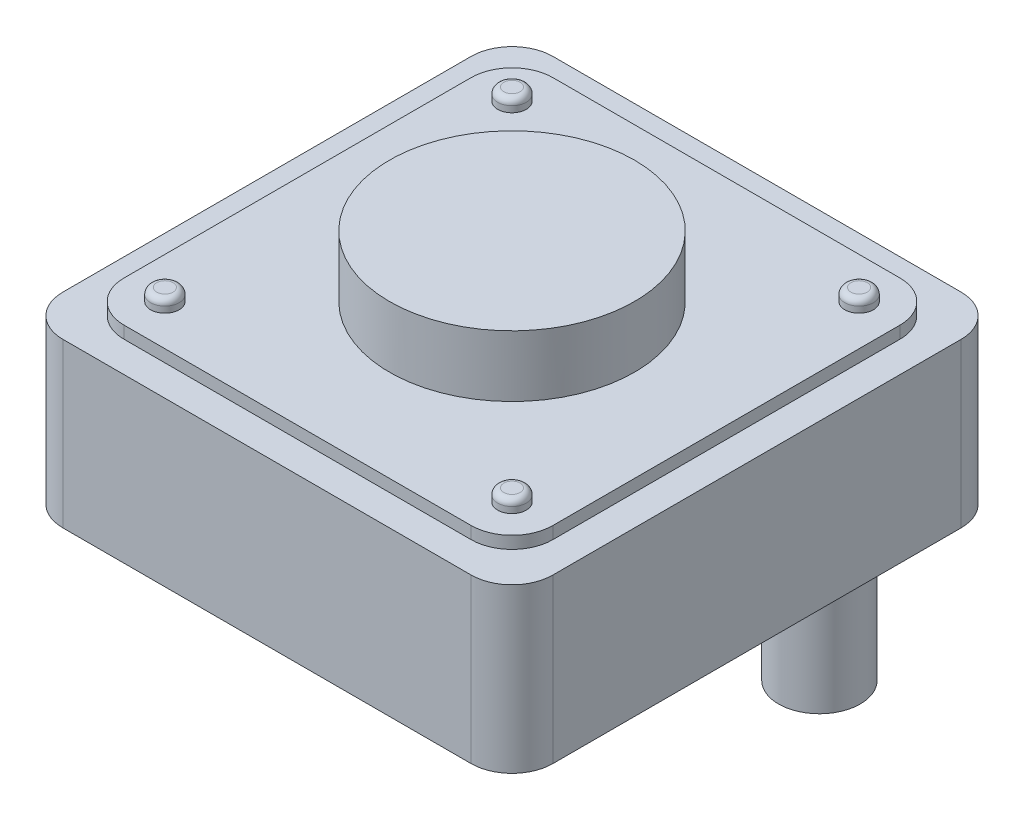
ISO-10303-21;
HEADER;
FILE_DESCRIPTION(('STEP AP214'),'2;1');
FILE_NAME('part.step','',(''),(''),'','','');
FILE_SCHEMA(('AUTOMOTIVE_DESIGN { 1 0 10303 214 1 1 1 1 }'));
ENDSEC;
DATA;
#1=APPLICATION_CONTEXT('core data for automotive mechanical design processes');
#2=APPLICATION_PROTOCOL_DEFINITION('international standard','automotive_design',2000,#1);
#3=PRODUCT_CONTEXT('',#1,'mechanical');
#4=PRODUCT('Part','Part','',(#3));
#5=PRODUCT_RELATED_PRODUCT_CATEGORY('part','',(#4));
#6=PRODUCT_DEFINITION_FORMATION('','',#4);
#7=PRODUCT_DEFINITION_CONTEXT('part definition',#1,'design');
#8=PRODUCT_DEFINITION('design','',#6,#7);
#9=PRODUCT_DEFINITION_SHAPE('','',#8);
#10=(LENGTH_UNIT() NAMED_UNIT(*) SI_UNIT(.MILLI.,.METRE.));
#11=(NAMED_UNIT(*) PLANE_ANGLE_UNIT() SI_UNIT($,.RADIAN.));
#12=(NAMED_UNIT(*) SI_UNIT($,.STERADIAN.) SOLID_ANGLE_UNIT());
#13=UNCERTAINTY_MEASURE_WITH_UNIT(LENGTH_MEASURE(1.E-05),#10,'distance_accuracy_value','');
#14=(GEOMETRIC_REPRESENTATION_CONTEXT(3) GLOBAL_UNCERTAINTY_ASSIGNED_CONTEXT((#13)) GLOBAL_UNIT_ASSIGNED_CONTEXT((#10,
#11,#12)) REPRESENTATION_CONTEXT('',''));
#15=CARTESIAN_POINT('',(0.,0.,0.));
#16=DIRECTION('',(0.,0.,1.));
#17=DIRECTION('',(1.,0.,0.));
#18=AXIS2_PLACEMENT_3D('',#15,#16,#17);
#19=CARTESIAN_POINT('',(-5.,4.,5.));
#20=DIRECTION('',(0.,1.,0.));
#21=DIRECTION('',(0.,0.,1.));
#22=AXIS2_PLACEMENT_3D('',#19,#20,#21);
#23=PLANE('',#22);
#24=CARTESIAN_POINT('',(-5.,4.,5.));
#25=DIRECTION('',(0.,1.,0.));
#26=DIRECTION('',(0.,0.,1.));
#27=AXIS2_PLACEMENT_3D('',#24,#25,#26);
#28=CIRCLE('',#27,1.);
#29=CARTESIAN_POINT('',(-6.,4.,4.99999999999999));
#30=VERTEX_POINT('',#29);
#31=CARTESIAN_POINT('',(-4.99999999999999,4.,6.));
#32=VERTEX_POINT('',#31);
#33=EDGE_CURVE('E249',#30,#32,#28,.T.);
#34=ORIENTED_EDGE('',*,*,#33,.T.);
#35=DIRECTION('',(1.,0.,0.));
#36=VECTOR('',#35,1.);
#37=CARTESIAN_POINT('',(-4.99999999999999,4.,6.));
#38=LINE('',#37,#36);
#39=CARTESIAN_POINT('',(5.,4.,6.));
#40=VERTEX_POINT('',#39);
#41=EDGE_CURVE('E252',#32,#40,#38,.T.);
#42=ORIENTED_EDGE('',*,*,#41,.T.);
#43=CARTESIAN_POINT('',(5.,4.,5.));
#44=DIRECTION('',(0.,1.,0.));
#45=DIRECTION('',(0.,0.,1.));
#46=AXIS2_PLACEMENT_3D('',#43,#44,#45);
#47=CIRCLE('',#46,1.);
#48=CARTESIAN_POINT('',(6.,4.,4.99999999999999));
#49=VERTEX_POINT('',#48);
#50=EDGE_CURVE('E255',#40,#49,#47,.T.);
#51=ORIENTED_EDGE('',*,*,#50,.T.);
#52=DIRECTION('',(0.,0.,-1.));
#53=VECTOR('',#52,1.);
#54=CARTESIAN_POINT('',(6.,4.,-4.99999999999999));
#55=LINE('',#54,#53);
#56=CARTESIAN_POINT('',(6.,4.,-4.99999999999999));
#57=VERTEX_POINT('',#56);
#58=EDGE_CURVE('E257',#49,#57,#55,.T.);
#59=ORIENTED_EDGE('',*,*,#58,.T.);
#60=CARTESIAN_POINT('',(5.,4.,-5.));
#61=DIRECTION('',(0.,1.,0.));
#62=DIRECTION('',(0.,0.,-1.));
#63=AXIS2_PLACEMENT_3D('',#60,#61,#62);
#64=CIRCLE('',#63,1.);
#65=CARTESIAN_POINT('',(4.99999999999999,4.,-6.));
#66=VERTEX_POINT('',#65);
#67=EDGE_CURVE('E259',#57,#66,#64,.T.);
#68=ORIENTED_EDGE('',*,*,#67,.T.);
#69=DIRECTION('',(-1.,0.,0.));
#70=VECTOR('',#69,1.);
#71=CARTESIAN_POINT('',(-4.99999999999999,4.,-6.));
#72=LINE('',#71,#70);
#73=CARTESIAN_POINT('',(-4.99999999999999,4.,-6.));
#74=VERTEX_POINT('',#73);
#75=EDGE_CURVE('E261',#66,#74,#72,.T.);
#76=ORIENTED_EDGE('',*,*,#75,.T.);
#77=CARTESIAN_POINT('',(-5.,4.,-5.));
#78=DIRECTION('',(0.,1.,0.));
#79=DIRECTION('',(0.,0.,1.));
#80=AXIS2_PLACEMENT_3D('',#77,#78,#79);
#81=CIRCLE('',#80,1.);
#82=CARTESIAN_POINT('',(-6.,4.,-4.99999999999999));
#83=VERTEX_POINT('',#82);
#84=EDGE_CURVE('E263',#74,#83,#81,.T.);
#85=ORIENTED_EDGE('',*,*,#84,.T.);
#86=DIRECTION('',(0.,0.,1.));
#87=VECTOR('',#86,1.);
#88=CARTESIAN_POINT('',(-6.,4.,-4.99999999999999));
#89=LINE('',#88,#87);
#90=EDGE_CURVE('E265',#83,#30,#89,.T.);
#91=ORIENTED_EDGE('',*,*,#90,.T.);
#92=EDGE_LOOP('',(#34,#42,#51,#59,#68,#76,#85,#91));
#93=FACE_BOUND('',#92,.T.);
#94=DIRECTION('',(-1.,0.,0.));
#95=VECTOR('',#94,1.);
#96=CARTESIAN_POINT('',(-4.24999999999999,4.,-5.25));
#97=LINE('',#96,#95);
#98=CARTESIAN_POINT('',(4.24999999999999,4.,-5.25));
#99=VERTEX_POINT('',#98);
#100=CARTESIAN_POINT('',(-4.24999999999999,4.,-5.25));
#101=VERTEX_POINT('',#100);
#102=EDGE_CURVE('E213',#99,#101,#97,.T.);
#103=ORIENTED_EDGE('',*,*,#102,.F.);
#104=CARTESIAN_POINT('',(4.25,4.,-4.25));
#105=DIRECTION('',(0.,1.,0.));
#106=DIRECTION('',(0.,0.,-1.));
#107=AXIS2_PLACEMENT_3D('',#104,#105,#106);
#108=CIRCLE('',#107,1.);
#109=CARTESIAN_POINT('',(5.25,4.,-4.24999999999999));
#110=VERTEX_POINT('',#109);
#111=EDGE_CURVE('E191',#110,#99,#108,.T.);
#112=ORIENTED_EDGE('',*,*,#111,.F.);
#113=DIRECTION('',(0.,0.,-1.));
#114=VECTOR('',#113,1.);
#115=CARTESIAN_POINT('',(5.25,4.,-4.24999999999999));
#116=LINE('',#115,#114);
#117=CARTESIAN_POINT('',(5.25,4.,4.24999999999999));
#118=VERTEX_POINT('',#117);
#119=EDGE_CURVE('E196',#118,#110,#116,.T.);
#120=ORIENTED_EDGE('',*,*,#119,.F.);
#121=CARTESIAN_POINT('',(4.25,4.,4.25));
#122=DIRECTION('',(0.,1.,0.));
#123=DIRECTION('',(0.,0.,1.));
#124=AXIS2_PLACEMENT_3D('',#121,#122,#123);
#125=CIRCLE('',#124,1.);
#126=CARTESIAN_POINT('',(4.24999999999999,4.,5.25));
#127=VERTEX_POINT('',#126);
#128=EDGE_CURVE('E223',#127,#118,#125,.T.);
#129=ORIENTED_EDGE('',*,*,#128,.F.);
#130=DIRECTION('',(1.,0.,0.));
#131=VECTOR('',#130,1.);
#132=CARTESIAN_POINT('',(-4.24999999999999,4.,5.25));
#133=LINE('',#132,#131);
#134=CARTESIAN_POINT('',(-4.25,4.,5.25));
#135=VERTEX_POINT('',#134);
#136=EDGE_CURVE('E221',#135,#127,#133,.T.);
#137=ORIENTED_EDGE('',*,*,#136,.F.);
#138=CARTESIAN_POINT('',(-4.25,4.,4.25));
#139=DIRECTION('',(0.,1.,0.));
#140=DIRECTION('',(0.,0.,1.));
#141=AXIS2_PLACEMENT_3D('',#138,#139,#140);
#142=CIRCLE('',#141,1.);
#143=CARTESIAN_POINT('',(-5.25,4.,4.24999999999999));
#144=VERTEX_POINT('',#143);
#145=EDGE_CURVE('E219',#144,#135,#142,.T.);
#146=ORIENTED_EDGE('',*,*,#145,.F.);
#147=DIRECTION('',(0.,0.,1.));
#148=VECTOR('',#147,1.);
#149=CARTESIAN_POINT('',(-5.25,4.,-4.24999999999999));
#150=LINE('',#149,#148);
#151=CARTESIAN_POINT('',(-5.25,4.,-4.24999999999999));
#152=VERTEX_POINT('',#151);
#153=EDGE_CURVE('E217',#152,#144,#150,.T.);
#154=ORIENTED_EDGE('',*,*,#153,.F.);
#155=CARTESIAN_POINT('',(-4.25,4.,-4.25));
#156=DIRECTION('',(0.,1.,0.));
#157=DIRECTION('',(0.,0.,1.));
#158=AXIS2_PLACEMENT_3D('',#155,#156,#157);
#159=CIRCLE('',#158,1.);
#160=EDGE_CURVE('E215',#101,#152,#159,.T.);
#161=ORIENTED_EDGE('',*,*,#160,.F.);
#162=EDGE_LOOP('',(#103,#112,#120,#129,#137,#146,#154,#161));
#163=FACE_BOUND('',#162,.T.);
#164=ADVANCED_FACE('F34',(#93,#163),#23,.T.);
#165=CARTESIAN_POINT('',(-5.,4.,5.));
#166=DIRECTION('',(0.,-1.,0.));
#167=DIRECTION('',(0.,0.,-1.));
#168=AXIS2_PLACEMENT_3D('',#165,#166,#167);
#169=CYLINDRICAL_SURFACE('',#168,1.);
#170=CARTESIAN_POINT('',(-5.,0.,5.));
#171=DIRECTION('',(0.,1.,0.));
#172=DIRECTION('',(0.,0.,1.));
#173=AXIS2_PLACEMENT_3D('',#170,#171,#172);
#174=CIRCLE('',#173,1.);
#175=CARTESIAN_POINT('',(-6.,0.,4.99999999999999));
#176=VERTEX_POINT('',#175);
#177=CARTESIAN_POINT('',(-4.99999999999999,0.,6.));
#178=VERTEX_POINT('',#177);
#179=EDGE_CURVE('E248',#176,#178,#174,.T.);
#180=ORIENTED_EDGE('',*,*,#179,.T.);
#181=DIRECTION('',(0.,-1.,0.));
#182=VECTOR('',#181,1.);
#183=CARTESIAN_POINT('',(-4.99999999999999,4.,6.));
#184=LINE('',#183,#182);
#185=EDGE_CURVE('E299',#32,#178,#184,.T.);
#186=ORIENTED_EDGE('',*,*,#185,.F.);
#187=ORIENTED_EDGE('',*,*,#33,.F.);
#188=DIRECTION('',(0.,-1.,0.));
#189=VECTOR('',#188,1.);
#190=CARTESIAN_POINT('',(-6.,4.,4.99999999999999));
#191=LINE('',#190,#189);
#192=EDGE_CURVE('E267',#30,#176,#191,.T.);
#193=ORIENTED_EDGE('',*,*,#192,.T.);
#194=EDGE_LOOP('',(#180,#186,#187,#193));
#195=FACE_BOUND('',#194,.T.);
#196=ADVANCED_FACE('F396',(#195),#169,.T.);
#197=CARTESIAN_POINT('',(-4.99999999999999,4.,6.));
#198=DIRECTION('',(0.,0.,-1.));
#199=DIRECTION('',(-1.,0.,0.));
#200=AXIS2_PLACEMENT_3D('',#197,#198,#199);
#201=PLANE('',#200);
#202=DIRECTION('',(1.,0.,0.));
#203=VECTOR('',#202,1.);
#204=CARTESIAN_POINT('',(-4.99999999999999,0.,6.));
#205=LINE('',#204,#203);
#206=CARTESIAN_POINT('',(5.,0.,6.));
#207=VERTEX_POINT('',#206);
#208=EDGE_CURVE('E270',#178,#207,#205,.T.);
#209=ORIENTED_EDGE('',*,*,#208,.T.);
#210=DIRECTION('',(0.,-1.,0.));
#211=VECTOR('',#210,1.);
#212=CARTESIAN_POINT('',(5.,4.,6.));
#213=LINE('',#212,#211);
#214=EDGE_CURVE('E296',#40,#207,#213,.T.);
#215=ORIENTED_EDGE('',*,*,#214,.F.);
#216=ORIENTED_EDGE('',*,*,#41,.F.);
#217=ORIENTED_EDGE('',*,*,#185,.T.);
#218=EDGE_LOOP('',(#209,#215,#216,#217));
#219=FACE_BOUND('',#218,.T.);
#220=ADVANCED_FACE('F402',(#219),#201,.F.);
#221=CARTESIAN_POINT('',(5.,4.,5.));
#222=DIRECTION('',(0.,-1.,0.));
#223=DIRECTION('',(0.,0.,-1.));
#224=AXIS2_PLACEMENT_3D('',#221,#222,#223);
#225=CYLINDRICAL_SURFACE('',#224,1.);
#226=CARTESIAN_POINT('',(5.,0.,5.));
#227=DIRECTION('',(0.,1.,0.));
#228=DIRECTION('',(0.,0.,1.));
#229=AXIS2_PLACEMENT_3D('',#226,#227,#228);
#230=CIRCLE('',#229,1.);
#231=CARTESIAN_POINT('',(6.,0.,4.99999999999999));
#232=VERTEX_POINT('',#231);
#233=EDGE_CURVE('E272',#207,#232,#230,.T.);
#234=ORIENTED_EDGE('',*,*,#233,.T.);
#235=DIRECTION('',(0.,-1.,0.));
#236=VECTOR('',#235,1.);
#237=CARTESIAN_POINT('',(6.,4.,4.99999999999999));
#238=LINE('',#237,#236);
#239=EDGE_CURVE('E293',#49,#232,#238,.T.);
#240=ORIENTED_EDGE('',*,*,#239,.F.);
#241=ORIENTED_EDGE('',*,*,#50,.F.);
#242=ORIENTED_EDGE('',*,*,#214,.T.);
#243=EDGE_LOOP('',(#234,#240,#241,#242));
#244=FACE_BOUND('',#243,.T.);
#245=ADVANCED_FACE('F427',(#244),#225,.T.);
#246=CARTESIAN_POINT('',(6.,4.,-4.99999999999999));
#247=DIRECTION('',(-1.,0.,0.));
#248=DIRECTION('',(0.,0.,1.));
#249=AXIS2_PLACEMENT_3D('',#246,#247,#248);
#250=PLANE('',#249);
#251=DIRECTION('',(0.,0.,-1.));
#252=VECTOR('',#251,1.);
#253=CARTESIAN_POINT('',(6.,0.,-4.99999999999999));
#254=LINE('',#253,#252);
#255=CARTESIAN_POINT('',(6.,0.,-4.99999999999999));
#256=VERTEX_POINT('',#255);
#257=EDGE_CURVE('E274',#232,#256,#254,.T.);
#258=ORIENTED_EDGE('',*,*,#257,.T.);
#259=DIRECTION('',(0.,-1.,0.));
#260=VECTOR('',#259,1.);
#261=CARTESIAN_POINT('',(6.,4.,-4.99999999999999));
#262=LINE('',#261,#260);
#263=EDGE_CURVE('E290',#57,#256,#262,.T.);
#264=ORIENTED_EDGE('',*,*,#263,.F.);
#265=ORIENTED_EDGE('',*,*,#58,.F.);
#266=ORIENTED_EDGE('',*,*,#239,.T.);
#267=EDGE_LOOP('',(#258,#264,#265,#266));
#268=FACE_BOUND('',#267,.T.);
#269=ADVANCED_FACE('F423',(#268),#250,.F.);
#270=CARTESIAN_POINT('',(5.,4.,-5.));
#271=DIRECTION('',(0.,-1.,0.));
#272=DIRECTION('',(0.,0.,-1.));
#273=AXIS2_PLACEMENT_3D('',#270,#271,#272);
#274=CYLINDRICAL_SURFACE('',#273,1.);
#275=CARTESIAN_POINT('',(5.,0.,-5.));
#276=DIRECTION('',(0.,1.,0.));
#277=DIRECTION('',(0.,0.,-1.));
#278=AXIS2_PLACEMENT_3D('',#275,#276,#277);
#279=CIRCLE('',#278,1.);
#280=CARTESIAN_POINT('',(4.99999999999999,0.,-6.));
#281=VERTEX_POINT('',#280);
#282=EDGE_CURVE('E172',#256,#281,#279,.T.);
#283=ORIENTED_EDGE('',*,*,#282,.T.);
#284=DIRECTION('',(0.,-1.,0.));
#285=VECTOR('',#284,1.);
#286=CARTESIAN_POINT('',(4.99999999999999,4.,-6.));
#287=LINE('',#286,#285);
#288=EDGE_CURVE('E287',#66,#281,#287,.T.);
#289=ORIENTED_EDGE('',*,*,#288,.F.);
#290=ORIENTED_EDGE('',*,*,#67,.F.);
#291=ORIENTED_EDGE('',*,*,#263,.T.);
#292=EDGE_LOOP('',(#283,#289,#290,#291));
#293=FACE_BOUND('',#292,.T.);
#294=ADVANCED_FACE('F420',(#293),#274,.T.);
#295=CARTESIAN_POINT('',(-4.99999999999999,4.,-6.));
#296=DIRECTION('',(0.,0.,1.));
#297=DIRECTION('',(1.,0.,0.));
#298=AXIS2_PLACEMENT_3D('',#295,#296,#297);
#299=PLANE('',#298);
#300=DIRECTION('',(-1.,0.,0.));
#301=VECTOR('',#300,1.);
#302=CARTESIAN_POINT('',(-4.99999999999999,0.,-6.));
#303=LINE('',#302,#301);
#304=CARTESIAN_POINT('',(2.73446833088224,0.,-6.));
#305=VERTEX_POINT('',#304);
#306=EDGE_CURVE('E173',#281,#305,#303,.T.);
#307=ORIENTED_EDGE('',*,*,#306,.T.);
#308=CARTESIAN_POINT('',(2.26553166911776,0.,-6.));
#309=VERTEX_POINT('',#308);
#310=EDGE_CURVE('E277',#305,#309,#303,.T.);
#311=ORIENTED_EDGE('',*,*,#310,.T.);
#312=CARTESIAN_POINT('',(-2.26553166911776,0.,-6.));
#313=VERTEX_POINT('',#312);
#314=EDGE_CURVE('E163',#309,#313,#303,.T.);
#315=ORIENTED_EDGE('',*,*,#314,.T.);
#316=CARTESIAN_POINT('',(-2.73446833088224,0.,-6.));
#317=VERTEX_POINT('',#316);
#318=EDGE_CURVE('E158',#313,#317,#303,.T.);
#319=ORIENTED_EDGE('',*,*,#318,.T.);
#320=CARTESIAN_POINT('',(-4.99999999999999,0.,-6.));
#321=VERTEX_POINT('',#320);
#322=EDGE_CURVE('E161',#317,#321,#303,.T.);
#323=ORIENTED_EDGE('',*,*,#322,.T.);
#324=DIRECTION('',(0.,-1.,0.));
#325=VECTOR('',#324,1.);
#326=CARTESIAN_POINT('',(-4.99999999999999,4.,-6.));
#327=LINE('',#326,#325);
#328=EDGE_CURVE('E285',#74,#321,#327,.T.);
#329=ORIENTED_EDGE('',*,*,#328,.F.);
#330=ORIENTED_EDGE('',*,*,#75,.F.);
#331=ORIENTED_EDGE('',*,*,#288,.T.);
#332=EDGE_LOOP('',(#307,#311,#315,#319,#323,#329,#330,#331));
#333=FACE_BOUND('',#332,.T.);
#334=ADVANCED_FACE('F159',(#333),#299,.F.);
#335=CARTESIAN_POINT('',(-5.,4.,-5.));
#336=DIRECTION('',(0.,-1.,0.));
#337=DIRECTION('',(0.,0.,-1.));
#338=AXIS2_PLACEMENT_3D('',#335,#336,#337);
#339=CYLINDRICAL_SURFACE('',#338,1.);
#340=CARTESIAN_POINT('',(-5.,0.,-5.));
#341=DIRECTION('',(0.,1.,0.));
#342=DIRECTION('',(0.,0.,1.));
#343=AXIS2_PLACEMENT_3D('',#340,#341,#342);
#344=CIRCLE('',#343,1.);
#345=CARTESIAN_POINT('',(-6.,0.,-4.99999999999999));
#346=VERTEX_POINT('',#345);
#347=EDGE_CURVE('E171',#321,#346,#344,.T.);
#348=ORIENTED_EDGE('',*,*,#347,.T.);
#349=DIRECTION('',(0.,-1.,0.));
#350=VECTOR('',#349,1.);
#351=CARTESIAN_POINT('',(-6.,4.,-4.99999999999999));
#352=LINE('',#351,#350);
#353=EDGE_CURVE('E282',#83,#346,#352,.T.);
#354=ORIENTED_EDGE('',*,*,#353,.F.);
#355=ORIENTED_EDGE('',*,*,#84,.F.);
#356=ORIENTED_EDGE('',*,*,#328,.T.);
#357=EDGE_LOOP('',(#348,#354,#355,#356));
#358=FACE_BOUND('',#357,.T.);
#359=ADVANCED_FACE('F413',(#358),#339,.T.);
#360=CARTESIAN_POINT('',(-6.,4.,-4.99999999999999));
#361=DIRECTION('',(1.,0.,0.));
#362=DIRECTION('',(0.,0.,-1.));
#363=AXIS2_PLACEMENT_3D('',#360,#361,#362);
#364=PLANE('',#363);
#365=DIRECTION('',(0.,0.,1.));
#366=VECTOR('',#365,1.);
#367=CARTESIAN_POINT('',(-6.,0.,-4.99999999999999));
#368=LINE('',#367,#366);
#369=EDGE_CURVE('E253',#346,#176,#368,.T.);
#370=ORIENTED_EDGE('',*,*,#369,.T.);
#371=ORIENTED_EDGE('',*,*,#192,.F.);
#372=ORIENTED_EDGE('',*,*,#90,.F.);
#373=ORIENTED_EDGE('',*,*,#353,.T.);
#374=EDGE_LOOP('',(#370,#371,#372,#373));
#375=FACE_BOUND('',#374,.T.);
#376=ADVANCED_FACE('F410',(#375),#364,.F.);
#377=CARTESIAN_POINT('',(-5.,0.,5.));
#378=DIRECTION('',(0.,1.,0.));
#379=DIRECTION('',(0.,0.,1.));
#380=AXIS2_PLACEMENT_3D('',#377,#378,#379);
#381=PLANE('',#380);
#382=CARTESIAN_POINT('',(-2.5,0.,-5.02787624151382));
#383=DIRECTION('',(0.,1.,0.));
#384=DIRECTION('',(0.,0.,1.));
#385=AXIS2_PLACEMENT_3D('',#382,#383,#384);
#386=CIRCLE('',#385,1.);
#387=EDGE_CURVE('E11',#313,#317,#386,.F.);
#388=ORIENTED_EDGE('',*,*,#387,.F.);
#389=ORIENTED_EDGE('',*,*,#314,.F.);
#390=CARTESIAN_POINT('',(2.5,0.,-5.02787624151382));
#391=DIRECTION('',(0.,-1.,0.));
#392=DIRECTION('',(0.,0.,-1.));
#393=AXIS2_PLACEMENT_3D('',#390,#391,#392);
#394=CIRCLE('',#393,1.);
#395=EDGE_CURVE('E53',#305,#309,#394,.T.);
#396=ORIENTED_EDGE('',*,*,#395,.F.);
#397=ORIENTED_EDGE('',*,*,#306,.F.);
#398=ORIENTED_EDGE('',*,*,#282,.F.);
#399=ORIENTED_EDGE('',*,*,#257,.F.);
#400=ORIENTED_EDGE('',*,*,#233,.F.);
#401=ORIENTED_EDGE('',*,*,#208,.F.);
#402=ORIENTED_EDGE('',*,*,#179,.F.);
#403=ORIENTED_EDGE('',*,*,#369,.F.);
#404=ORIENTED_EDGE('',*,*,#347,.F.);
#405=ORIENTED_EDGE('',*,*,#322,.F.);
#406=EDGE_LOOP('',(#388,#389,#396,#397,#398,#399,#400,#401,#402,#403,#404,#405));
#407=FACE_BOUND('',#406,.T.);
#408=ADVANCED_FACE('F169',(#407),#381,.F.);
#409=CARTESIAN_POINT('',(4.25,4.3,-4.25));
#410=DIRECTION('',(0.,-1.,0.));
#411=DIRECTION('',(0.,0.,-1.));
#412=AXIS2_PLACEMENT_3D('',#409,#410,#411);
#413=CYLINDRICAL_SURFACE('',#412,1.);
#414=ORIENTED_EDGE('',*,*,#111,.T.);
#415=DIRECTION('',(0.,-1.,0.));
#416=VECTOR('',#415,1.);
#417=CARTESIAN_POINT('',(4.24999999999999,4.3,-5.25));
#418=LINE('',#417,#416);
#419=CARTESIAN_POINT('',(4.24999999999999,4.3,-5.25));
#420=VERTEX_POINT('',#419);
#421=EDGE_CURVE('E246',#420,#99,#418,.T.);
#422=ORIENTED_EDGE('',*,*,#421,.F.);
#423=CARTESIAN_POINT('',(4.25,4.3,-4.25));
#424=DIRECTION('',(0.,1.,0.));
#425=DIRECTION('',(0.,0.,-1.));
#426=AXIS2_PLACEMENT_3D('',#423,#424,#425);
#427=CIRCLE('',#426,1.);
#428=CARTESIAN_POINT('',(5.25,4.3,-4.24999999999999));
#429=VERTEX_POINT('',#428);
#430=EDGE_CURVE('E192',#429,#420,#427,.T.);
#431=ORIENTED_EDGE('',*,*,#430,.F.);
#432=DIRECTION('',(0.,-1.,0.));
#433=VECTOR('',#432,1.);
#434=CARTESIAN_POINT('',(5.25,4.3,-4.24999999999999));
#435=LINE('',#434,#433);
#436=EDGE_CURVE('E210',#429,#110,#435,.T.);
#437=ORIENTED_EDGE('',*,*,#436,.T.);
#438=EDGE_LOOP('',(#414,#422,#431,#437));
#439=FACE_BOUND('',#438,.T.);
#440=ADVANCED_FACE('F362',(#439),#413,.T.);
#441=CARTESIAN_POINT('',(-4.24999999999999,4.3,-5.25));
#442=DIRECTION('',(0.,0.,1.));
#443=DIRECTION('',(1.,0.,0.));
#444=AXIS2_PLACEMENT_3D('',#441,#442,#443);
#445=PLANE('',#444);
#446=ORIENTED_EDGE('',*,*,#102,.T.);
#447=DIRECTION('',(0.,-1.,0.));
#448=VECTOR('',#447,1.);
#449=CARTESIAN_POINT('',(-4.24999999999999,4.3,-5.25));
#450=LINE('',#449,#448);
#451=CARTESIAN_POINT('',(-4.24999999999999,4.3,-5.25));
#452=VERTEX_POINT('',#451);
#453=EDGE_CURVE('E243',#452,#101,#450,.T.);
#454=ORIENTED_EDGE('',*,*,#453,.F.);
#455=DIRECTION('',(-1.,0.,0.));
#456=VECTOR('',#455,1.);
#457=CARTESIAN_POINT('',(-4.24999999999999,4.3,-5.25));
#458=LINE('',#457,#456);
#459=EDGE_CURVE('E195',#420,#452,#458,.T.);
#460=ORIENTED_EDGE('',*,*,#459,.F.);
#461=ORIENTED_EDGE('',*,*,#421,.T.);
#462=EDGE_LOOP('',(#446,#454,#460,#461));
#463=FACE_BOUND('',#462,.T.);
#464=ADVANCED_FACE('F366',(#463),#445,.F.);
#465=CARTESIAN_POINT('',(-4.25,4.3,-4.25));
#466=DIRECTION('',(0.,-1.,0.));
#467=DIRECTION('',(0.,0.,-1.));
#468=AXIS2_PLACEMENT_3D('',#465,#466,#467);
#469=CYLINDRICAL_SURFACE('',#468,1.);
#470=ORIENTED_EDGE('',*,*,#160,.T.);
#471=DIRECTION('',(0.,-1.,0.));
#472=VECTOR('',#471,1.);
#473=CARTESIAN_POINT('',(-5.25,4.3,-4.24999999999999));
#474=LINE('',#473,#472);
#475=CARTESIAN_POINT('',(-5.25,4.3,-4.24999999999999));
#476=VERTEX_POINT('',#475);
#477=EDGE_CURVE('E240',#476,#152,#474,.T.);
#478=ORIENTED_EDGE('',*,*,#477,.F.);
#479=CARTESIAN_POINT('',(-4.25,4.3,-4.25));
#480=DIRECTION('',(0.,1.,0.));
#481=DIRECTION('',(0.,0.,1.));
#482=AXIS2_PLACEMENT_3D('',#479,#480,#481);
#483=CIRCLE('',#482,1.);
#484=EDGE_CURVE('E198',#452,#476,#483,.T.);
#485=ORIENTED_EDGE('',*,*,#484,.F.);
#486=ORIENTED_EDGE('',*,*,#453,.T.);
#487=EDGE_LOOP('',(#470,#478,#485,#486));
#488=FACE_BOUND('',#487,.T.);
#489=ADVANCED_FACE('F371',(#488),#469,.T.);
#490=CARTESIAN_POINT('',(-5.25,4.3,-4.24999999999999));
#491=DIRECTION('',(1.,0.,0.));
#492=DIRECTION('',(0.,0.,-1.));
#493=AXIS2_PLACEMENT_3D('',#490,#491,#492);
#494=PLANE('',#493);
#495=ORIENTED_EDGE('',*,*,#153,.T.);
#496=DIRECTION('',(0.,-1.,0.));
#497=VECTOR('',#496,1.);
#498=CARTESIAN_POINT('',(-5.25,4.3,4.24999999999999));
#499=LINE('',#498,#497);
#500=CARTESIAN_POINT('',(-5.25,4.3,4.24999999999999));
#501=VERTEX_POINT('',#500);
#502=EDGE_CURVE('E237',#501,#144,#499,.T.);
#503=ORIENTED_EDGE('',*,*,#502,.F.);
#504=DIRECTION('',(0.,0.,1.));
#505=VECTOR('',#504,1.);
#506=CARTESIAN_POINT('',(-5.25,4.3,-4.24999999999999));
#507=LINE('',#506,#505);
#508=EDGE_CURVE('E200',#476,#501,#507,.T.);
#509=ORIENTED_EDGE('',*,*,#508,.F.);
#510=ORIENTED_EDGE('',*,*,#477,.T.);
#511=EDGE_LOOP('',(#495,#503,#509,#510));
#512=FACE_BOUND('',#511,.T.);
#513=ADVANCED_FACE('F377',(#512),#494,.F.);
#514=CARTESIAN_POINT('',(-4.25,4.3,4.25));
#515=DIRECTION('',(0.,-1.,0.));
#516=DIRECTION('',(0.,0.,-1.));
#517=AXIS2_PLACEMENT_3D('',#514,#515,#516);
#518=CYLINDRICAL_SURFACE('',#517,1.);
#519=ORIENTED_EDGE('',*,*,#145,.T.);
#520=DIRECTION('',(0.,-1.,0.));
#521=VECTOR('',#520,1.);
#522=CARTESIAN_POINT('',(-4.25,4.3,5.25));
#523=LINE('',#522,#521);
#524=CARTESIAN_POINT('',(-4.25,4.3,5.25));
#525=VERTEX_POINT('',#524);
#526=EDGE_CURVE('E234',#525,#135,#523,.T.);
#527=ORIENTED_EDGE('',*,*,#526,.F.);
#528=CARTESIAN_POINT('',(-4.25,4.3,4.25));
#529=DIRECTION('',(0.,1.,0.));
#530=DIRECTION('',(0.,0.,1.));
#531=AXIS2_PLACEMENT_3D('',#528,#529,#530);
#532=CIRCLE('',#531,1.);
#533=EDGE_CURVE('E202',#501,#525,#532,.T.);
#534=ORIENTED_EDGE('',*,*,#533,.F.);
#535=ORIENTED_EDGE('',*,*,#502,.T.);
#536=EDGE_LOOP('',(#519,#527,#534,#535));
#537=FACE_BOUND('',#536,.T.);
#538=ADVANCED_FACE('F381',(#537),#518,.T.);
#539=CARTESIAN_POINT('',(-4.24999999999999,4.3,5.25));
#540=DIRECTION('',(0.,0.,-1.));
#541=DIRECTION('',(-1.,0.,0.));
#542=AXIS2_PLACEMENT_3D('',#539,#540,#541);
#543=PLANE('',#542);
#544=ORIENTED_EDGE('',*,*,#136,.T.);
#545=DIRECTION('',(0.,-1.,0.));
#546=VECTOR('',#545,1.);
#547=CARTESIAN_POINT('',(4.24999999999999,4.3,5.25));
#548=LINE('',#547,#546);
#549=CARTESIAN_POINT('',(4.24999999999999,4.3,5.25));
#550=VERTEX_POINT('',#549);
#551=EDGE_CURVE('E231',#550,#127,#548,.T.);
#552=ORIENTED_EDGE('',*,*,#551,.F.);
#553=DIRECTION('',(1.,0.,0.));
#554=VECTOR('',#553,1.);
#555=CARTESIAN_POINT('',(-4.24999999999999,4.3,5.25));
#556=LINE('',#555,#554);
#557=EDGE_CURVE('E204',#525,#550,#556,.T.);
#558=ORIENTED_EDGE('',*,*,#557,.F.);
#559=ORIENTED_EDGE('',*,*,#526,.T.);
#560=EDGE_LOOP('',(#544,#552,#558,#559));
#561=FACE_BOUND('',#560,.T.);
#562=ADVANCED_FACE('F386',(#561),#543,.F.);
#563=CARTESIAN_POINT('',(4.25,4.3,4.25));
#564=DIRECTION('',(0.,-1.,0.));
#565=DIRECTION('',(0.,0.,-1.));
#566=AXIS2_PLACEMENT_3D('',#563,#564,#565);
#567=CYLINDRICAL_SURFACE('',#566,1.);
#568=ORIENTED_EDGE('',*,*,#128,.T.);
#569=DIRECTION('',(0.,-1.,0.));
#570=VECTOR('',#569,1.);
#571=CARTESIAN_POINT('',(5.25,4.3,4.24999999999999));
#572=LINE('',#571,#570);
#573=CARTESIAN_POINT('',(5.25,4.3,4.24999999999999));
#574=VERTEX_POINT('',#573);
#575=EDGE_CURVE('E229',#574,#118,#572,.T.);
#576=ORIENTED_EDGE('',*,*,#575,.F.);
#577=CARTESIAN_POINT('',(4.25,4.3,4.25));
#578=DIRECTION('',(0.,1.,0.));
#579=DIRECTION('',(0.,0.,1.));
#580=AXIS2_PLACEMENT_3D('',#577,#578,#579);
#581=CIRCLE('',#580,1.);
#582=EDGE_CURVE('E206',#550,#574,#581,.T.);
#583=ORIENTED_EDGE('',*,*,#582,.F.);
#584=ORIENTED_EDGE('',*,*,#551,.T.);
#585=EDGE_LOOP('',(#568,#576,#583,#584));
#586=FACE_BOUND('',#585,.T.);
#587=ADVANCED_FACE('F390',(#586),#567,.T.);
#588=CARTESIAN_POINT('',(5.25,4.3,-4.24999999999999));
#589=DIRECTION('',(-1.,0.,0.));
#590=DIRECTION('',(0.,0.,1.));
#591=AXIS2_PLACEMENT_3D('',#588,#589,#590);
#592=PLANE('',#591);
#593=ORIENTED_EDGE('',*,*,#119,.T.);
#594=ORIENTED_EDGE('',*,*,#436,.F.);
#595=DIRECTION('',(0.,0.,-1.));
#596=VECTOR('',#595,1.);
#597=CARTESIAN_POINT('',(5.25,4.3,-4.24999999999999));
#598=LINE('',#597,#596);
#599=EDGE_CURVE('E208',#574,#429,#598,.T.);
#600=ORIENTED_EDGE('',*,*,#599,.F.);
#601=ORIENTED_EDGE('',*,*,#575,.T.);
#602=EDGE_LOOP('',(#593,#594,#600,#601));
#603=FACE_BOUND('',#602,.T.);
#604=ADVANCED_FACE('F346',(#603),#592,.F.);
#605=CARTESIAN_POINT('',(4.25,4.3,-4.25));
#606=DIRECTION('',(0.,-1.,0.));
#607=DIRECTION('',(0.,0.,-1.));
#608=AXIS2_PLACEMENT_3D('',#605,#606,#607);
#609=PLANE('',#608);
#610=CARTESIAN_POINT('',(0.,4.3,0.));
#611=DIRECTION('',(0.,-1.,0.));
#612=DIRECTION('',(0.,0.,-1.));
#613=AXIS2_PLACEMENT_3D('',#610,#611,#612);
#614=CIRCLE('',#613,3.);
#615=CARTESIAN_POINT('',(0.,4.3,-3.));
#616=VERTEX_POINT('',#615);
#617=EDGE_CURVE('E42',#616,#616,#614,.F.);
#618=ORIENTED_EDGE('',*,*,#617,.F.);
#619=EDGE_LOOP('',(#618));
#620=FACE_BOUND('',#619,.T.);
#621=CARTESIAN_POINT('',(-4.25,4.3,-4.24999999999999));
#622=DIRECTION('',(0.,-1.,0.));
#623=DIRECTION('',(0.,0.,-1.));
#624=AXIS2_PLACEMENT_3D('',#621,#622,#623);
#625=CIRCLE('',#624,0.35);
#626=CARTESIAN_POINT('',(-4.25,4.3,-4.59999999999999));
#627=VERTEX_POINT('',#626);
#628=EDGE_CURVE('E311',#627,#627,#625,.F.);
#629=ORIENTED_EDGE('',*,*,#628,.F.);
#630=EDGE_LOOP('',(#629));
#631=FACE_BOUND('',#630,.T.);
#632=CARTESIAN_POINT('',(-4.25,4.3,4.25));
#633=DIRECTION('',(0.,-1.,0.));
#634=DIRECTION('',(0.,0.,-1.));
#635=AXIS2_PLACEMENT_3D('',#632,#633,#634);
#636=CIRCLE('',#635,0.35);
#637=CARTESIAN_POINT('',(-4.25,4.3,3.9));
#638=VERTEX_POINT('',#637);
#639=EDGE_CURVE('E308',#638,#638,#636,.F.);
#640=ORIENTED_EDGE('',*,*,#639,.F.);
#641=EDGE_LOOP('',(#640));
#642=FACE_BOUND('',#641,.T.);
#643=CARTESIAN_POINT('',(4.25,4.3,4.25));
#644=DIRECTION('',(0.,-1.,0.));
#645=DIRECTION('',(0.,0.,-1.));
#646=AXIS2_PLACEMENT_3D('',#643,#644,#645);
#647=CIRCLE('',#646,0.35);
#648=CARTESIAN_POINT('',(4.25,4.3,3.9));
#649=VERTEX_POINT('',#648);
#650=EDGE_CURVE('E305',#649,#649,#647,.F.);
#651=ORIENTED_EDGE('',*,*,#650,.F.);
#652=EDGE_LOOP('',(#651));
#653=FACE_BOUND('',#652,.T.);
#654=CARTESIAN_POINT('',(4.25,4.3,-4.25));
#655=DIRECTION('',(0.,-1.,0.));
#656=DIRECTION('',(0.,0.,-1.));
#657=AXIS2_PLACEMENT_3D('',#654,#655,#656);
#658=CIRCLE('',#657,0.35);
#659=CARTESIAN_POINT('',(4.25,4.3,-4.6));
#660=VERTEX_POINT('',#659);
#661=EDGE_CURVE('E302',#660,#660,#658,.F.);
#662=ORIENTED_EDGE('',*,*,#661,.F.);
#663=EDGE_LOOP('',(#662));
#664=FACE_BOUND('',#663,.T.);
#665=ORIENTED_EDGE('',*,*,#430,.T.);
#666=ORIENTED_EDGE('',*,*,#459,.T.);
#667=ORIENTED_EDGE('',*,*,#484,.T.);
#668=ORIENTED_EDGE('',*,*,#508,.T.);
#669=ORIENTED_EDGE('',*,*,#533,.T.);
#670=ORIENTED_EDGE('',*,*,#557,.T.);
#671=ORIENTED_EDGE('',*,*,#582,.T.);
#672=ORIENTED_EDGE('',*,*,#599,.T.);
#673=EDGE_LOOP('',(#665,#666,#667,#668,#669,#670,#671,#672));
#674=FACE_BOUND('',#673,.T.);
#675=ADVANCED_FACE('F342',(#620,#631,#642,#653,#664,#674),#609,.F.);
#676=CARTESIAN_POINT('',(4.25,4.6,-4.25));
#677=DIRECTION('',(0.,-1.,0.));
#678=DIRECTION('',(0.,0.,-1.));
#679=AXIS2_PLACEMENT_3D('',#676,#677,#678);
#680=CYLINDRICAL_SURFACE('',#679,0.35);
#681=CARTESIAN_POINT('',(4.25,4.45,-4.25));
#682=DIRECTION('',(0.,1.,0.));
#683=DIRECTION('',(0.,0.,1.));
#684=AXIS2_PLACEMENT_3D('',#681,#682,#683);
#685=CIRCLE('',#684,0.35);
#686=CARTESIAN_POINT('',(4.25,4.45,-3.9));
#687=VERTEX_POINT('',#686);
#688=EDGE_CURVE('E335',#687,#687,#685,.F.);
#689=ORIENTED_EDGE('',*,*,#688,.T.);
#690=EDGE_LOOP('',(#689));
#691=FACE_BOUND('',#690,.T.);
#692=ORIENTED_EDGE('',*,*,#661,.T.);
#693=EDGE_LOOP('',(#692));
#694=FACE_BOUND('',#693,.T.);
#695=ADVANCED_FACE('F345',(#691,#694),#680,.T.);
#696=CARTESIAN_POINT('',(4.25,4.6,-4.25));
#697=DIRECTION('',(0.,1.,0.));
#698=DIRECTION('',(0.,0.,1.));
#699=AXIS2_PLACEMENT_3D('',#696,#697,#698);
#700=PLANE('',#699);
#701=CARTESIAN_POINT('',(4.25,4.6,-4.25));
#702=DIRECTION('',(0.,1.,0.));
#703=DIRECTION('',(0.,0.,1.));
#704=AXIS2_PLACEMENT_3D('',#701,#702,#703);
#705=CIRCLE('',#704,0.2);
#706=CARTESIAN_POINT('',(4.25,4.6,-4.05));
#707=VERTEX_POINT('',#706);
#708=EDGE_CURVE('E332',#707,#707,#705,.T.);
#709=ORIENTED_EDGE('',*,*,#708,.T.);
#710=EDGE_LOOP('',(#709));
#711=FACE_BOUND('',#710,.T.);
#712=ADVANCED_FACE('F466',(#711),#700,.T.);
#713=CARTESIAN_POINT('',(4.25,4.6,4.25));
#714=DIRECTION('',(0.,-1.,0.));
#715=DIRECTION('',(0.,0.,-1.));
#716=AXIS2_PLACEMENT_3D('',#713,#714,#715);
#717=CYLINDRICAL_SURFACE('',#716,0.35);
#718=CARTESIAN_POINT('',(4.25,4.45,4.25));
#719=DIRECTION('',(0.,-1.,0.));
#720=DIRECTION('',(0.,0.,-1.));
#721=AXIS2_PLACEMENT_3D('',#718,#719,#720);
#722=CIRCLE('',#721,0.35);
#723=CARTESIAN_POINT('',(4.25,4.45,3.9));
#724=VERTEX_POINT('',#723);
#725=EDGE_CURVE('E329',#724,#724,#722,.T.);
#726=ORIENTED_EDGE('',*,*,#725,.T.);
#727=EDGE_LOOP('',(#726));
#728=FACE_BOUND('',#727,.T.);
#729=ORIENTED_EDGE('',*,*,#650,.T.);
#730=EDGE_LOOP('',(#729));
#731=FACE_BOUND('',#730,.T.);
#732=ADVANCED_FACE('F457',(#728,#731),#717,.T.);
#733=CARTESIAN_POINT('',(4.25,4.6,4.25));
#734=DIRECTION('',(0.,-1.,0.));
#735=DIRECTION('',(0.,0.,-1.));
#736=AXIS2_PLACEMENT_3D('',#733,#734,#735);
#737=PLANE('',#736);
#738=CARTESIAN_POINT('',(4.25,4.6,4.25));
#739=DIRECTION('',(0.,-1.,0.));
#740=DIRECTION('',(0.,0.,-1.));
#741=AXIS2_PLACEMENT_3D('',#738,#739,#740);
#742=CIRCLE('',#741,0.2);
#743=CARTESIAN_POINT('',(4.25,4.6,4.05));
#744=VERTEX_POINT('',#743);
#745=EDGE_CURVE('E326',#744,#744,#742,.F.);
#746=ORIENTED_EDGE('',*,*,#745,.T.);
#747=EDGE_LOOP('',(#746));
#748=FACE_BOUND('',#747,.T.);
#749=ADVANCED_FACE('F454',(#748),#737,.F.);
#750=CARTESIAN_POINT('',(-4.25,4.6,4.25));
#751=DIRECTION('',(0.,-1.,0.));
#752=DIRECTION('',(0.,0.,-1.));
#753=AXIS2_PLACEMENT_3D('',#750,#751,#752);
#754=CYLINDRICAL_SURFACE('',#753,0.35);
#755=CARTESIAN_POINT('',(-4.25,4.45,4.25));
#756=DIRECTION('',(0.,1.,0.));
#757=DIRECTION('',(0.,0.,1.));
#758=AXIS2_PLACEMENT_3D('',#755,#756,#757);
#759=CIRCLE('',#758,0.35);
#760=CARTESIAN_POINT('',(-4.25,4.45,4.6));
#761=VERTEX_POINT('',#760);
#762=EDGE_CURVE('E323',#761,#761,#759,.F.);
#763=ORIENTED_EDGE('',*,*,#762,.T.);
#764=EDGE_LOOP('',(#763));
#765=FACE_BOUND('',#764,.T.);
#766=ORIENTED_EDGE('',*,*,#639,.T.);
#767=EDGE_LOOP('',(#766));
#768=FACE_BOUND('',#767,.T.);
#769=ADVANCED_FACE('F456',(#765,#768),#754,.T.);
#770=CARTESIAN_POINT('',(-4.25,4.6,4.25));
#771=DIRECTION('',(0.,1.,0.));
#772=DIRECTION('',(0.,0.,1.));
#773=AXIS2_PLACEMENT_3D('',#770,#771,#772);
#774=PLANE('',#773);
#775=CARTESIAN_POINT('',(-4.25,4.6,4.25));
#776=DIRECTION('',(0.,1.,0.));
#777=DIRECTION('',(0.,0.,1.));
#778=AXIS2_PLACEMENT_3D('',#775,#776,#777);
#779=CIRCLE('',#778,0.2);
#780=CARTESIAN_POINT('',(-4.25,4.6,4.45));
#781=VERTEX_POINT('',#780);
#782=EDGE_CURVE('E320',#781,#781,#779,.T.);
#783=ORIENTED_EDGE('',*,*,#782,.T.);
#784=EDGE_LOOP('',(#783));
#785=FACE_BOUND('',#784,.T.);
#786=ADVANCED_FACE('F463',(#785),#774,.T.);
#787=CARTESIAN_POINT('',(-4.25,4.6,-4.24999999999999));
#788=DIRECTION('',(0.,-1.,0.));
#789=DIRECTION('',(0.,0.,-1.));
#790=AXIS2_PLACEMENT_3D('',#787,#788,#789);
#791=CYLINDRICAL_SURFACE('',#790,0.35);
#792=CARTESIAN_POINT('',(-4.25,4.45,-4.24999999999999));
#793=DIRECTION('',(0.,-1.,0.));
#794=DIRECTION('',(0.,0.,-1.));
#795=AXIS2_PLACEMENT_3D('',#792,#793,#794);
#796=CIRCLE('',#795,0.35);
#797=CARTESIAN_POINT('',(-4.25,4.45,-4.59999999999999));
#798=VERTEX_POINT('',#797);
#799=EDGE_CURVE('E317',#798,#798,#796,.T.);
#800=ORIENTED_EDGE('',*,*,#799,.T.);
#801=EDGE_LOOP('',(#800));
#802=FACE_BOUND('',#801,.T.);
#803=ORIENTED_EDGE('',*,*,#628,.T.);
#804=EDGE_LOOP('',(#803));
#805=FACE_BOUND('',#804,.T.);
#806=ADVANCED_FACE('F631',(#802,#805),#791,.T.);
#807=CARTESIAN_POINT('',(-4.25,4.6,-4.24999999999999));
#808=DIRECTION('',(0.,-1.,0.));
#809=DIRECTION('',(0.,0.,-1.));
#810=AXIS2_PLACEMENT_3D('',#807,#808,#809);
#811=PLANE('',#810);
#812=CARTESIAN_POINT('',(-4.25,4.6,-4.24999999999999));
#813=DIRECTION('',(0.,-1.,0.));
#814=DIRECTION('',(0.,0.,-1.));
#815=AXIS2_PLACEMENT_3D('',#812,#813,#814);
#816=CIRCLE('',#815,0.2);
#817=CARTESIAN_POINT('',(-4.25,4.6,-4.44999999999999));
#818=VERTEX_POINT('',#817);
#819=EDGE_CURVE('E314',#818,#818,#816,.F.);
#820=ORIENTED_EDGE('',*,*,#819,.T.);
#821=EDGE_LOOP('',(#820));
#822=FACE_BOUND('',#821,.T.);
#823=ADVANCED_FACE('F439',(#822),#811,.F.);
#824=CARTESIAN_POINT('',(-4.25,4.45,-4.24999999999999));
#825=DIRECTION('',(0.,-1.,0.));
#826=DIRECTION('',(0.,0.,-1.));
#827=AXIS2_PLACEMENT_3D('',#824,#825,#826);
#828=TOROIDAL_SURFACE('',#827,0.2,0.15);
#829=ORIENTED_EDGE('',*,*,#799,.F.);
#830=EDGE_LOOP('',(#829));
#831=FACE_BOUND('',#830,.T.);
#832=ORIENTED_EDGE('',*,*,#819,.F.);
#833=EDGE_LOOP('',(#832));
#834=FACE_BOUND('',#833,.T.);
#835=ADVANCED_FACE('F435',(#831,#834),#828,.T.);
#836=CARTESIAN_POINT('',(-4.25,4.45,4.25));
#837=DIRECTION('',(0.,1.,0.));
#838=DIRECTION('',(0.,0.,1.));
#839=AXIS2_PLACEMENT_3D('',#836,#837,#838);
#840=TOROIDAL_SURFACE('',#839,0.2,0.15);
#841=ORIENTED_EDGE('',*,*,#762,.F.);
#842=EDGE_LOOP('',(#841));
#843=FACE_BOUND('',#842,.T.);
#844=ORIENTED_EDGE('',*,*,#782,.F.);
#845=EDGE_LOOP('',(#844));
#846=FACE_BOUND('',#845,.T.);
#847=ADVANCED_FACE('F438',(#843,#846),#840,.T.);
#848=CARTESIAN_POINT('',(4.25,4.45,4.25));
#849=DIRECTION('',(0.,-1.,0.));
#850=DIRECTION('',(0.,0.,-1.));
#851=AXIS2_PLACEMENT_3D('',#848,#849,#850);
#852=TOROIDAL_SURFACE('',#851,0.2,0.15);
#853=ORIENTED_EDGE('',*,*,#725,.F.);
#854=EDGE_LOOP('',(#853));
#855=FACE_BOUND('',#854,.T.);
#856=ORIENTED_EDGE('',*,*,#745,.F.);
#857=EDGE_LOOP('',(#856));
#858=FACE_BOUND('',#857,.T.);
#859=ADVANCED_FACE('F442',(#855,#858),#852,.T.);
#860=CARTESIAN_POINT('',(4.25,4.45,-4.25));
#861=DIRECTION('',(0.,1.,0.));
#862=DIRECTION('',(0.,0.,1.));
#863=AXIS2_PLACEMENT_3D('',#860,#861,#862);
#864=TOROIDAL_SURFACE('',#863,0.2,0.15);
#865=ORIENTED_EDGE('',*,*,#688,.F.);
#866=EDGE_LOOP('',(#865));
#867=FACE_BOUND('',#866,.T.);
#868=ORIENTED_EDGE('',*,*,#708,.F.);
#869=EDGE_LOOP('',(#868));
#870=FACE_BOUND('',#869,.T.);
#871=ADVANCED_FACE('F36',(#867,#870),#864,.T.);
#872=CARTESIAN_POINT('',(0.,5.8,0.));
#873=DIRECTION('',(0.,-1.,0.));
#874=DIRECTION('',(0.,0.,-1.));
#875=AXIS2_PLACEMENT_3D('',#872,#873,#874);
#876=CYLINDRICAL_SURFACE('',#875,3.);
#877=CARTESIAN_POINT('',(0.,5.8,0.));
#878=DIRECTION('',(0.,1.,0.));
#879=DIRECTION('',(0.,0.,1.));
#880=AXIS2_PLACEMENT_3D('',#877,#878,#879);
#881=CIRCLE('',#880,3.);
#882=CARTESIAN_POINT('',(0.,5.8,3.));
#883=VERTEX_POINT('',#882);
#884=EDGE_CURVE('E187',#883,#883,#881,.T.);
#885=ORIENTED_EDGE('',*,*,#884,.F.);
#886=EDGE_LOOP('',(#885));
#887=FACE_BOUND('',#886,.T.);
#888=ORIENTED_EDGE('',*,*,#617,.T.);
#889=EDGE_LOOP('',(#888));
#890=FACE_BOUND('',#889,.T.);
#891=ADVANCED_FACE('F340',(#887,#890),#876,.T.);
#892=CARTESIAN_POINT('',(0.,5.8,0.));
#893=DIRECTION('',(0.,1.,0.));
#894=DIRECTION('',(0.,0.,1.));
#895=AXIS2_PLACEMENT_3D('',#892,#893,#894);
#896=PLANE('',#895);
#897=ORIENTED_EDGE('',*,*,#884,.T.);
#898=EDGE_LOOP('',(#897));
#899=FACE_BOUND('',#898,.T.);
#900=ADVANCED_FACE('F670',(#899),#896,.T.);
#901=CARTESIAN_POINT('',(2.5,-5.,-5.02787624151382));
#902=DIRECTION('',(0.,1.,0.));
#903=DIRECTION('',(0.,0.,1.));
#904=AXIS2_PLACEMENT_3D('',#901,#902,#903);
#905=CYLINDRICAL_SURFACE('',#904,1.);
#906=CARTESIAN_POINT('',(2.5,-5.,-5.02787624151382));
#907=DIRECTION('',(0.,-1.,0.));
#908=DIRECTION('',(0.,0.,-1.));
#909=AXIS2_PLACEMENT_3D('',#906,#907,#908);
#910=CIRCLE('',#909,1.);
#911=CARTESIAN_POINT('',(2.5,-5.,-6.02787624151382));
#912=VERTEX_POINT('',#911);
#913=EDGE_CURVE('E184',#912,#912,#910,.T.);
#914=ORIENTED_EDGE('',*,*,#913,.F.);
#915=EDGE_LOOP('',(#914));
#916=FACE_BOUND('',#915,.T.);
#917=ORIENTED_EDGE('',*,*,#395,.T.);
#918=EDGE_CURVE('E181',#309,#305,#394,.T.);
#919=ORIENTED_EDGE('',*,*,#918,.T.);
#920=EDGE_LOOP('',(#917,#919));
#921=FACE_BOUND('',#920,.T.);
#922=ADVANCED_FACE('F678',(#916,#921),#905,.T.);
#923=CARTESIAN_POINT('',(2.5,-5.,-5.02787624151382));
#924=DIRECTION('',(0.,-1.,0.));
#925=DIRECTION('',(0.,0.,-1.));
#926=AXIS2_PLACEMENT_3D('',#923,#924,#925);
#927=PLANE('',#926);
#928=ORIENTED_EDGE('',*,*,#913,.T.);
#929=EDGE_LOOP('',(#928));
#930=FACE_BOUND('',#929,.T.);
#931=ADVANCED_FACE('F686',(#930),#927,.T.);
#932=CARTESIAN_POINT('',(2.5,0.,-5.02787624151382));
#933=DIRECTION('',(0.,-1.,0.));
#934=DIRECTION('',(0.,0.,-1.));
#935=AXIS2_PLACEMENT_3D('',#932,#933,#934);
#936=PLANE('',#935);
#937=ORIENTED_EDGE('',*,*,#310,.F.);
#938=ORIENTED_EDGE('',*,*,#918,.F.);
#939=EDGE_LOOP('',(#937,#938));
#940=FACE_BOUND('',#939,.T.);
#941=ADVANCED_FACE('F695',(#940),#936,.F.);
#942=CARTESIAN_POINT('',(-2.5,0.,-5.02787624151382));
#943=DIRECTION('',(0.,1.,0.));
#944=DIRECTION('',(0.,0.,1.));
#945=AXIS2_PLACEMENT_3D('',#942,#943,#944);
#946=PLANE('',#945);
#947=ORIENTED_EDGE('',*,*,#318,.F.);
#948=CARTESIAN_POINT('',(-2.5,0.,-5.02787624151382));
#949=DIRECTION('',(0.,-1.,0.));
#950=DIRECTION('',(0.,0.,1.));
#951=AXIS2_PLACEMENT_3D('',#948,#949,#950);
#952=CIRCLE('',#951,1.);
#953=EDGE_CURVE('E176',#317,#313,#952,.T.);
#954=ORIENTED_EDGE('',*,*,#953,.F.);
#955=EDGE_LOOP('',(#947,#954));
#956=FACE_BOUND('',#955,.T.);
#957=ADVANCED_FACE('F177',(#956),#946,.T.);
#958=CARTESIAN_POINT('',(-2.5,-5.,-5.02787624151382));
#959=DIRECTION('',(0.,1.,0.));
#960=DIRECTION('',(0.,0.,1.));
#961=AXIS2_PLACEMENT_3D('',#958,#959,#960);
#962=CYLINDRICAL_SURFACE('',#961,1.);
#963=CARTESIAN_POINT('',(-2.5,-5.,-5.02787624151382));
#964=DIRECTION('',(0.,-1.,0.));
#965=DIRECTION('',(0.,0.,1.));
#966=AXIS2_PLACEMENT_3D('',#963,#964,#965);
#967=CIRCLE('',#966,1.);
#968=CARTESIAN_POINT('',(-2.5,-5.,-4.02787624151382));
#969=VERTEX_POINT('',#968);
#970=EDGE_CURVE('E178',#969,#969,#967,.T.);
#971=ORIENTED_EDGE('',*,*,#970,.F.);
#972=EDGE_LOOP('',(#971));
#973=FACE_BOUND('',#972,.T.);
#974=ORIENTED_EDGE('',*,*,#953,.T.);
#975=ORIENTED_EDGE('',*,*,#387,.T.);
#976=EDGE_LOOP('',(#974,#975));
#977=FACE_BOUND('',#976,.T.);
#978=ADVANCED_FACE('F175',(#973,#977),#962,.T.);
#979=CARTESIAN_POINT('',(-2.5,-5.,-5.02787624151382));
#980=DIRECTION('',(0.,1.,0.));
#981=DIRECTION('',(0.,0.,1.));
#982=AXIS2_PLACEMENT_3D('',#979,#980,#981);
#983=PLANE('',#982);
#984=ORIENTED_EDGE('',*,*,#970,.T.);
#985=EDGE_LOOP('',(#984));
#986=FACE_BOUND('',#985,.T.);
#987=ADVANCED_FACE('F719',(#986),#983,.F.);
#988=CLOSED_SHELL('',(#164,#196,#220,#245,#269,#294,#334,#359,#376,#408,#440,#464,#489,#513,
#538,#562,#587,#604,#675,#695,#712,#732,#749,#769,#786,#806,#823,#835,#847,#859,#871,#891,#900,
#922,#931,#941,#957,#978,#987));
#989=MANIFOLD_SOLID_BREP('B2',#988);
#990=ADVANCED_BREP_SHAPE_REPRESENTATION('',(#18,#989),#14);
#991=SHAPE_DEFINITION_REPRESENTATION(#9,#990);
ENDSEC;
END-ISO-10303-21;
